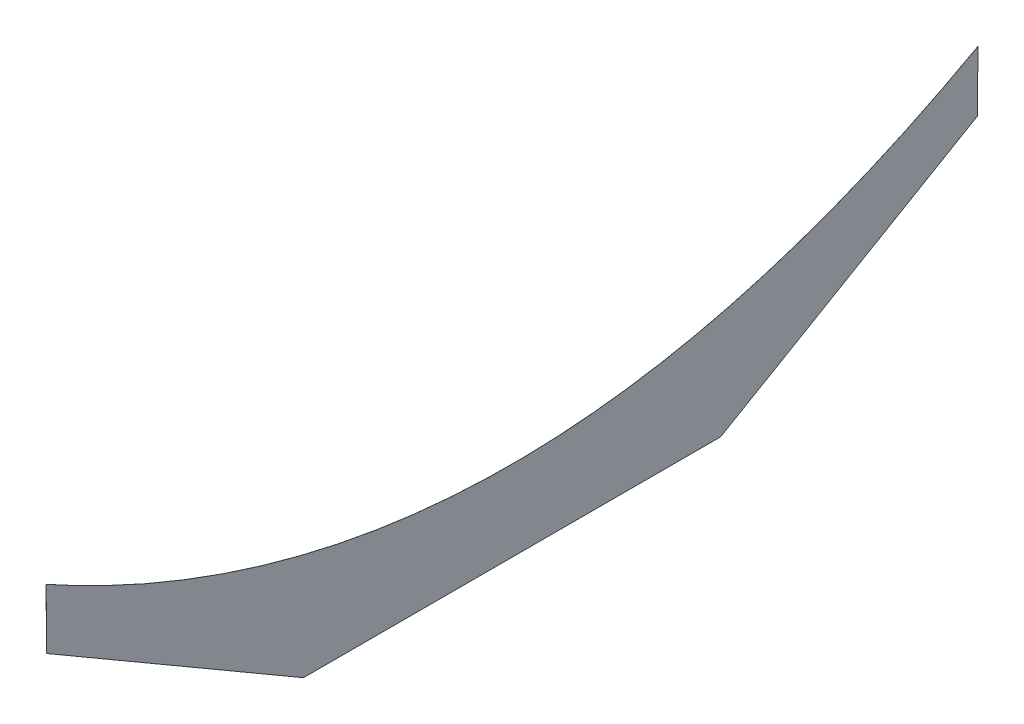
ISO-10303-21;
HEADER;
FILE_DESCRIPTION(('STEP AP214'),'2;1');
FILE_NAME('part.step','',(''),(''),'','','');
FILE_SCHEMA(('AUTOMOTIVE_DESIGN { 1 0 10303 214 1 1 1 1 }'));
ENDSEC;
DATA;
#1=APPLICATION_CONTEXT('core data for automotive mechanical design processes');
#2=APPLICATION_PROTOCOL_DEFINITION('international standard','automotive_design',2000,#1);
#3=PRODUCT_CONTEXT('',#1,'mechanical');
#4=PRODUCT('Part','Part','',(#3));
#5=PRODUCT_RELATED_PRODUCT_CATEGORY('part','',(#4));
#6=PRODUCT_DEFINITION_FORMATION('','',#4);
#7=PRODUCT_DEFINITION_CONTEXT('part definition',#1,'design');
#8=PRODUCT_DEFINITION('design','',#6,#7);
#9=PRODUCT_DEFINITION_SHAPE('','',#8);
#10=(LENGTH_UNIT() NAMED_UNIT(*) SI_UNIT(.MILLI.,.METRE.));
#11=(NAMED_UNIT(*) PLANE_ANGLE_UNIT() SI_UNIT($,.RADIAN.));
#12=(NAMED_UNIT(*) SI_UNIT($,.STERADIAN.) SOLID_ANGLE_UNIT());
#13=UNCERTAINTY_MEASURE_WITH_UNIT(LENGTH_MEASURE(1.E-05),#10,'distance_accuracy_value','');
#14=(GEOMETRIC_REPRESENTATION_CONTEXT(3) GLOBAL_UNCERTAINTY_ASSIGNED_CONTEXT((#13)) GLOBAL_UNIT_ASSIGNED_CONTEXT((#10,
#11,#12)) REPRESENTATION_CONTEXT('',''));
#15=CARTESIAN_POINT('',(0.,0.,0.));
#16=DIRECTION('',(0.,0.,1.));
#17=DIRECTION('',(1.,0.,0.));
#18=AXIS2_PLACEMENT_3D('',#15,#16,#17);
#19=CARTESIAN_POINT('',(0.127,124.676062291817,734.407163706857));
#20=DIRECTION('',(0.,0.0110628443220398,-0.999938804865331));
#21=DIRECTION('',(0.,0.999938804865331,0.0110628443220398));
#22=AXIS2_PLACEMENT_3D('',#19,#20,#21);
#23=PLANE('',#22);
#24=DIRECTION('',(0.,-0.999938804865331,-0.0110628443220398));
#25=VECTOR('',#24,1.);
#26=CARTESIAN_POINT('',(0.,124.676062291817,734.407163706857));
#27=LINE('',#26,#25);
#28=CARTESIAN_POINT('',(0.,124.676062291817,734.407163706857));
#29=VERTEX_POINT('',#28);
#30=CARTESIAN_POINT('',(0.,29.7612376927359,733.357071517931));
#31=VERTEX_POINT('',#30);
#32=EDGE_CURVE('E125',#29,#31,#27,.T.);
#33=ORIENTED_EDGE('',*,*,#32,.T.);
#34=DIRECTION('',(-1.,0.,0.));
#35=VECTOR('',#34,1.);
#36=CARTESIAN_POINT('',(0.127,29.7612376927359,733.357071517931));
#37=LINE('',#36,#35);
#38=CARTESIAN_POINT('',(0.127,29.7612376927359,733.357071517931));
#39=VERTEX_POINT('',#38);
#40=EDGE_CURVE('E40',#39,#31,#37,.T.);
#41=ORIENTED_EDGE('',*,*,#40,.F.);
#42=DIRECTION('',(0.,-0.999938804865331,-0.0110628443220398));
#43=VECTOR('',#42,1.);
#44=CARTESIAN_POINT('',(0.127,124.676062291817,734.407163706857));
#45=LINE('',#44,#43);
#46=CARTESIAN_POINT('',(0.127,124.676062291817,734.407163706857));
#47=VERTEX_POINT('',#46);
#48=EDGE_CURVE('E86',#47,#39,#45,.T.);
#49=ORIENTED_EDGE('',*,*,#48,.F.);
#50=DIRECTION('',(-1.,0.,0.));
#51=VECTOR('',#50,1.);
#52=CARTESIAN_POINT('',(0.127,124.676062291817,734.407163706857));
#53=LINE('',#52,#51);
#54=EDGE_CURVE('E11',#47,#29,#53,.T.);
#55=ORIENTED_EDGE('',*,*,#54,.T.);
#56=EDGE_LOOP('',(#33,#41,#49,#55));
#57=FACE_BOUND('',#56,.T.);
#58=ADVANCED_FACE('F32',(#57),#23,.F.);
#59=CARTESIAN_POINT('',(0.127,-205.52393770825,328.770779224495));
#60=DIRECTION('',(0.,0.864450932066101,-0.502717202858675));
#61=DIRECTION('',(0.,0.502717202858675,0.864450932066101));
#62=AXIS2_PLACEMENT_3D('',#59,#60,#61);
#63=PLANE('',#62);
#64=DIRECTION('',(0.,-0.502717202858675,-0.864450932066101));
#65=VECTOR('',#64,1.);
#66=CARTESIAN_POINT('',(0.,-205.52393770825,328.770779224495));
#67=LINE('',#66,#65);
#68=CARTESIAN_POINT('',(0.,-205.52393770825,328.770779224495));
#69=VERTEX_POINT('',#68);
#70=EDGE_CURVE('E151',#31,#69,#67,.T.);
#71=ORIENTED_EDGE('',*,*,#70,.T.);
#72=DIRECTION('',(-1.,0.,0.));
#73=VECTOR('',#72,1.);
#74=CARTESIAN_POINT('',(0.127,-205.52393770825,328.770779224495));
#75=LINE('',#74,#73);
#76=CARTESIAN_POINT('',(0.127,-205.52393770825,328.770779224495));
#77=VERTEX_POINT('',#76);
#78=EDGE_CURVE('E109',#77,#69,#75,.T.);
#79=ORIENTED_EDGE('',*,*,#78,.F.);
#80=DIRECTION('',(0.,-0.502717202858675,-0.864450932066101));
#81=VECTOR('',#80,1.);
#82=CARTESIAN_POINT('',(0.127,-205.52393770825,328.770779224495));
#83=LINE('',#82,#81);
#84=EDGE_CURVE('E100',#39,#77,#83,.T.);
#85=ORIENTED_EDGE('',*,*,#84,.F.);
#86=ORIENTED_EDGE('',*,*,#40,.T.);
#87=EDGE_LOOP('',(#71,#79,#85,#86));
#88=FACE_BOUND('',#87,.T.);
#89=ADVANCED_FACE('F143',(#88),#63,.F.);
#90=CARTESIAN_POINT('',(0.127,-205.523937708882,-328.770751491312));
#91=DIRECTION('',(0.,1.,-9.61147588776446E-13));
#92=DIRECTION('',(0.,9.61147588776446E-13,1.));
#93=AXIS2_PLACEMENT_3D('',#90,#91,#92);
#94=PLANE('',#93);
#95=DIRECTION('',(0.,-9.61147588776446E-13,-1.));
#96=VECTOR('',#95,1.);
#97=CARTESIAN_POINT('',(0.,-205.523937708882,-328.770751491312));
#98=LINE('',#97,#96);
#99=CARTESIAN_POINT('',(0.,-205.523937708882,-328.770751491312));
#100=VERTEX_POINT('',#99);
#101=EDGE_CURVE('E108',#69,#100,#98,.T.);
#102=ORIENTED_EDGE('',*,*,#101,.T.);
#103=DIRECTION('',(-1.,0.,0.));
#104=VECTOR('',#103,1.);
#105=CARTESIAN_POINT('',(0.127,-205.523937708882,-328.770751491312));
#106=LINE('',#105,#104);
#107=CARTESIAN_POINT('',(0.127,-205.523937708882,-328.770751491312));
#108=VERTEX_POINT('',#107);
#109=EDGE_CURVE('E105',#108,#100,#106,.T.);
#110=ORIENTED_EDGE('',*,*,#109,.F.);
#111=DIRECTION('',(0.,-9.61147588776446E-13,-1.));
#112=VECTOR('',#111,1.);
#113=CARTESIAN_POINT('',(0.127,-205.523937708882,-328.770751491312));
#114=LINE('',#113,#112);
#115=EDGE_CURVE('E94',#77,#108,#114,.T.);
#116=ORIENTED_EDGE('',*,*,#115,.F.);
#117=ORIENTED_EDGE('',*,*,#78,.T.);
#118=EDGE_LOOP('',(#102,#110,#116,#117));
#119=FACE_BOUND('',#118,.T.);
#120=ADVANCED_FACE('F106',(#119),#94,.F.);
#121=CARTESIAN_POINT('',(0.127,-205.523937708882,-328.770751491312));
#122=DIRECTION('',(0.,0.864450932067067,0.502717202857013));
#123=DIRECTION('',(0.,-0.502717202857013,0.864450932067067));
#124=AXIS2_PLACEMENT_3D('',#121,#122,#123);
#125=PLANE('',#124);
#126=DIRECTION('',(0.,0.502717202857013,-0.864450932067067));
#127=VECTOR('',#126,1.);
#128=CARTESIAN_POINT('',(0.,-205.523937708882,-328.770751491312));
#129=LINE('',#128,#127);
#130=CARTESIAN_POINT('',(0.,29.7612376913262,-733.3570437852));
#131=VERTEX_POINT('',#130);
#132=EDGE_CURVE('E72',#100,#131,#129,.T.);
#133=ORIENTED_EDGE('',*,*,#132,.T.);
#134=DIRECTION('',(-1.,0.,0.));
#135=VECTOR('',#134,1.);
#136=CARTESIAN_POINT('',(0.127,29.7612376913262,-733.3570437852));
#137=LINE('',#136,#135);
#138=CARTESIAN_POINT('',(0.127,29.7612376913262,-733.3570437852));
#139=VERTEX_POINT('',#138);
#140=EDGE_CURVE('E110',#139,#131,#137,.T.);
#141=ORIENTED_EDGE('',*,*,#140,.F.);
#142=DIRECTION('',(0.,0.502717202857013,-0.864450932067067));
#143=VECTOR('',#142,1.);
#144=CARTESIAN_POINT('',(0.127,-205.523937708882,-328.770751491312));
#145=LINE('',#144,#143);
#146=EDGE_CURVE('E98',#108,#139,#145,.T.);
#147=ORIENTED_EDGE('',*,*,#146,.F.);
#148=ORIENTED_EDGE('',*,*,#109,.T.);
#149=EDGE_LOOP('',(#133,#141,#147,#148));
#150=FACE_BOUND('',#149,.T.);
#151=ADVANCED_FACE('F112',(#150),#125,.F.);
#152=CARTESIAN_POINT('',(0.127,124.676146581975,-734.407089329589));
#153=DIRECTION('',(0.,0.0110623431535074,0.999938810409894));
#154=DIRECTION('',(0.,-0.999938810409894,0.0110623431535074));
#155=AXIS2_PLACEMENT_3D('',#152,#153,#154);
#156=PLANE('',#155);
#157=DIRECTION('',(0.,0.999938810409894,-0.0110623431535074));
#158=VECTOR('',#157,1.);
#159=CARTESIAN_POINT('',(0.,124.676146581975,-734.407089329589));
#160=LINE('',#159,#158);
#161=CARTESIAN_POINT('',(0.,124.676146582756,-734.40708933105));
#162=VERTEX_POINT('',#161);
#163=EDGE_CURVE('E79',#131,#162,#160,.T.);
#164=ORIENTED_EDGE('',*,*,#163,.T.);
#165=DIRECTION('',(-1.,0.,0.));
#166=VECTOR('',#165,1.);
#167=CARTESIAN_POINT('',(0.127,124.676146582756,-734.40708933105));
#168=LINE('',#167,#166);
#169=CARTESIAN_POINT('',(0.127,124.676146582756,-734.40708933105));
#170=VERTEX_POINT('',#169);
#171=EDGE_CURVE('E116',#170,#162,#168,.T.);
#172=ORIENTED_EDGE('',*,*,#171,.F.);
#173=DIRECTION('',(0.,0.999938810409894,-0.0110623431535074));
#174=VECTOR('',#173,1.);
#175=CARTESIAN_POINT('',(0.127,124.676146581975,-734.407089329589));
#176=LINE('',#175,#174);
#177=EDGE_CURVE('E114',#139,#170,#176,.T.);
#178=ORIENTED_EDGE('',*,*,#177,.F.);
#179=ORIENTED_EDGE('',*,*,#140,.T.);
#180=EDGE_LOOP('',(#164,#172,#178,#179));
#181=FACE_BOUND('',#180,.T.);
#182=ADVANCED_FACE('F135',(#181),#156,.F.);
#183=CARTESIAN_POINT('',(0.127,999921.479894961,-51519.8250007154));
#184=CARTESIAN_POINT('',(0.127,-1000078.52392098,-0.0740675083079623));
#185=CARTESIAN_POINT('',(0.127,999921.472263061,51519.9731357321));
#186=B_SPLINE_CURVE_WITH_KNOTS('',2,(#183,#184,#185),.UNSPECIFIED.,.F.,.F.,(3,3),(0.,1.),.UNSPECIFIED.);
#187=DIRECTION('',(-1.,0.,0.));
#188=VECTOR('',#187,1.);
#189=SURFACE_OF_LINEAR_EXTRUSION('',#186,#188);
#190=CARTESIAN_POINT('',(0.,999921.479894961,-51519.8250007154));
#191=CARTESIAN_POINT('',(0.,-1000078.52392098,-0.0740675083079623));
#192=CARTESIAN_POINT('',(0.,999921.472263061,51519.9731357321));
#193=B_SPLINE_CURVE_WITH_KNOTS('',2,(#190,#191,#192),.UNSPECIFIED.,.F.,.F.,(3,3),(0.,1.),.UNSPECIFIED.);
#194=EDGE_CURVE('E124',#162,#29,#193,.T.);
#195=ORIENTED_EDGE('',*,*,#194,.T.);
#196=ORIENTED_EDGE('',*,*,#54,.F.);
#197=EDGE_CURVE('E48',#170,#47,#186,.T.);
#198=ORIENTED_EDGE('',*,*,#197,.F.);
#199=ORIENTED_EDGE('',*,*,#171,.T.);
#200=EDGE_LOOP('',(#195,#196,#198,#199));
#201=FACE_BOUND('',#200,.T.);
#202=ADVANCED_FACE('F131',(#201),#189,.F.);
#203=CARTESIAN_POINT('',(0.127,-78.5239209863278,0.));
#204=DIRECTION('',(1.,0.,0.));
#205=DIRECTION('',(0.,0.,-1.));
#206=AXIS2_PLACEMENT_3D('',#203,#204,#205);
#207=PLANE('',#206);
#208=ORIENTED_EDGE('',*,*,#197,.T.);
#209=ORIENTED_EDGE('',*,*,#48,.T.);
#210=ORIENTED_EDGE('',*,*,#84,.T.);
#211=ORIENTED_EDGE('',*,*,#115,.T.);
#212=ORIENTED_EDGE('',*,*,#146,.T.);
#213=ORIENTED_EDGE('',*,*,#177,.T.);
#214=EDGE_LOOP('',(#208,#209,#210,#211,#212,#213));
#215=FACE_BOUND('',#214,.T.);
#216=ADVANCED_FACE('F96',(#215),#207,.T.);
#217=CARTESIAN_POINT('',(0.,-78.5239209863278,0.));
#218=DIRECTION('',(1.,0.,0.));
#219=DIRECTION('',(0.,0.,-1.));
#220=AXIS2_PLACEMENT_3D('',#217,#218,#219);
#221=PLANE('',#220);
#222=ORIENTED_EDGE('',*,*,#32,.F.);
#223=ORIENTED_EDGE('',*,*,#194,.F.);
#224=ORIENTED_EDGE('',*,*,#163,.F.);
#225=ORIENTED_EDGE('',*,*,#132,.F.);
#226=ORIENTED_EDGE('',*,*,#101,.F.);
#227=ORIENTED_EDGE('',*,*,#70,.F.);
#228=EDGE_LOOP('',(#222,#223,#224,#225,#226,#227));
#229=FACE_BOUND('',#228,.T.);
#230=ADVANCED_FACE('F136',(#229),#221,.F.);
#231=CLOSED_SHELL('',(#58,#89,#120,#151,#182,#202,#216,#230));
#232=MANIFOLD_SOLID_BREP('B2',#231);
#233=ADVANCED_BREP_SHAPE_REPRESENTATION('',(#18,#232),#14);
#234=SHAPE_DEFINITION_REPRESENTATION(#9,#233);
ENDSEC;
END-ISO-10303-21;
